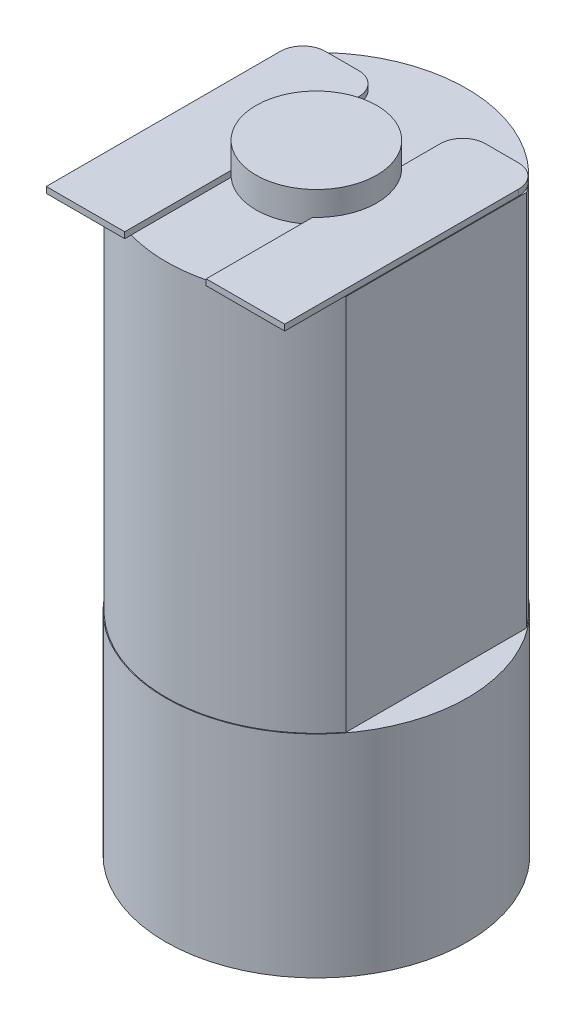
ISO-10303-21;
HEADER;
FILE_DESCRIPTION(('STEP AP214'),'2;1');
FILE_NAME('part.step','',(''),(''),'','','');
FILE_SCHEMA(('AUTOMOTIVE_DESIGN { 1 0 10303 214 1 1 1 1 }'));
ENDSEC;
DATA;
#1=APPLICATION_CONTEXT('core data for automotive mechanical design processes');
#2=APPLICATION_PROTOCOL_DEFINITION('international standard','automotive_design',2000,#1);
#3=PRODUCT_CONTEXT('',#1,'mechanical');
#4=PRODUCT('Part','Part','',(#3));
#5=PRODUCT_RELATED_PRODUCT_CATEGORY('part','',(#4));
#6=PRODUCT_DEFINITION_FORMATION('','',#4);
#7=PRODUCT_DEFINITION_CONTEXT('part definition',#1,'design');
#8=PRODUCT_DEFINITION('design','',#6,#7);
#9=PRODUCT_DEFINITION_SHAPE('','',#8);
#10=(LENGTH_UNIT() NAMED_UNIT(*) SI_UNIT(.MILLI.,.METRE.));
#11=(NAMED_UNIT(*) PLANE_ANGLE_UNIT() SI_UNIT($,.RADIAN.));
#12=(NAMED_UNIT(*) SI_UNIT($,.STERADIAN.) SOLID_ANGLE_UNIT());
#13=UNCERTAINTY_MEASURE_WITH_UNIT(LENGTH_MEASURE(1.E-05),#10,'distance_accuracy_value','');
#14=(GEOMETRIC_REPRESENTATION_CONTEXT(3) GLOBAL_UNCERTAINTY_ASSIGNED_CONTEXT((#13)) GLOBAL_UNIT_ASSIGNED_CONTEXT((#10,
#11,#12)) REPRESENTATION_CONTEXT('',''));
#15=CARTESIAN_POINT('',(0.,0.,0.));
#16=DIRECTION('',(0.,0.,1.));
#17=DIRECTION('',(1.,0.,0.));
#18=AXIS2_PLACEMENT_3D('',#15,#16,#17);
#19=CARTESIAN_POINT('',(0.,19.5,0.));
#20=DIRECTION('',(0.,1.,0.));
#21=DIRECTION('',(0.,0.,1.));
#22=AXIS2_PLACEMENT_3D('',#19,#20,#21);
#23=PLANE('',#22);
#24=DIRECTION('',(0.,0.,-1.));
#25=VECTOR('',#24,1.);
#26=CARTESIAN_POINT('',(-1.35,19.5,-2.75));
#27=LINE('',#26,#25);
#28=CARTESIAN_POINT('',(-1.35,19.5,-1.47563545633737));
#29=VERTEX_POINT('',#28);
#30=CARTESIAN_POINT('',(-1.35,19.5,-2.75));
#31=VERTEX_POINT('',#30);
#32=EDGE_CURVE('E314',#29,#31,#27,.T.);
#33=ORIENTED_EDGE('',*,*,#32,.F.);
#34=CARTESIAN_POINT('',(0.,19.5,0.));
#35=DIRECTION('',(0.,1.,0.));
#36=DIRECTION('',(0.,0.,1.));
#37=AXIS2_PLACEMENT_3D('',#34,#35,#36);
#38=CIRCLE('',#37,2.);
#39=CARTESIAN_POINT('',(1.35,19.5,-1.47563545633737));
#40=VERTEX_POINT('',#39);
#41=EDGE_CURVE('E466',#40,#29,#38,.T.);
#42=ORIENTED_EDGE('',*,*,#41,.F.);
#43=DIRECTION('',(0.,0.,1.));
#44=VECTOR('',#43,1.);
#45=CARTESIAN_POINT('',(1.35,19.5,-2.74999999999999));
#46=LINE('',#45,#44);
#47=CARTESIAN_POINT('',(1.35,19.5,-2.74999999999999));
#48=VERTEX_POINT('',#47);
#49=EDGE_CURVE('E207',#48,#40,#46,.T.);
#50=ORIENTED_EDGE('',*,*,#49,.F.);
#51=CARTESIAN_POINT('',(2.1,19.5,-2.74999999999999));
#52=DIRECTION('',(0.,1.,0.));
#53=DIRECTION('',(0.,0.,-1.));
#54=AXIS2_PLACEMENT_3D('',#51,#52,#53);
#55=CIRCLE('',#54,0.75);
#56=CARTESIAN_POINT('',(2.1,19.5,-3.49999999999999));
#57=VERTEX_POINT('',#56);
#58=EDGE_CURVE('E256',#57,#48,#55,.T.);
#59=ORIENTED_EDGE('',*,*,#58,.F.);
#60=DIRECTION('',(-1.,0.,0.));
#61=VECTOR('',#60,1.);
#62=CARTESIAN_POINT('',(3.2,19.5,-3.49999999999999));
#63=LINE('',#62,#61);
#64=CARTESIAN_POINT('',(3.2,19.5,-3.49999999999999));
#65=VERTEX_POINT('',#64);
#66=EDGE_CURVE('E253',#65,#57,#63,.T.);
#67=ORIENTED_EDGE('',*,*,#66,.F.);
#68=CARTESIAN_POINT('',(3.2,19.5,-2.74999999999999));
#69=DIRECTION('',(0.,1.,0.));
#70=DIRECTION('',(0.,0.,-1.));
#71=AXIS2_PLACEMENT_3D('',#68,#69,#70);
#72=CIRCLE('',#71,0.75);
#73=CARTESIAN_POINT('',(3.95,19.5,-2.74999999999999));
#74=VERTEX_POINT('',#73);
#75=EDGE_CURVE('E250',#74,#65,#72,.T.);
#76=ORIENTED_EDGE('',*,*,#75,.F.);
#77=DIRECTION('',(0.,0.,1.));
#78=VECTOR('',#77,1.);
#79=CARTESIAN_POINT('',(3.95,19.5,0.));
#80=LINE('',#79,#78);
#81=CARTESIAN_POINT('',(3.95,19.5,3.02458674863195));
#82=VERTEX_POINT('',#81);
#83=EDGE_CURVE('E48',#74,#82,#80,.T.);
#84=ORIENTED_EDGE('',*,*,#83,.T.);
#85=CARTESIAN_POINT('',(0.,19.5,0.));
#86=DIRECTION('',(0.,1.,0.));
#87=DIRECTION('',(0.,0.,1.));
#88=AXIS2_PLACEMENT_3D('',#85,#86,#87);
#89=CIRCLE('',#88,4.975);
#90=CARTESIAN_POINT('',(3.975,19.5,2.99165506033032));
#91=VERTEX_POINT('',#90);
#92=EDGE_CURVE('E367',#82,#91,#89,.T.);
#93=ORIENTED_EDGE('',*,*,#92,.T.);
#94=DIRECTION('',(0.,0.,-1.));
#95=VECTOR('',#94,1.);
#96=CARTESIAN_POINT('',(3.975,19.5,-2.99165506033032));
#97=LINE('',#96,#95);
#98=CARTESIAN_POINT('',(3.975,19.5,-2.99165506033032));
#99=VERTEX_POINT('',#98);
#100=EDGE_CURVE('E372',#91,#99,#97,.T.);
#101=ORIENTED_EDGE('',*,*,#100,.T.);
#102=CARTESIAN_POINT('',(0.,19.5,0.));
#103=DIRECTION('',(0.,1.,0.));
#104=DIRECTION('',(0.,0.,1.));
#105=AXIS2_PLACEMENT_3D('',#102,#103,#104);
#106=CIRCLE('',#105,4.975);
#107=CARTESIAN_POINT('',(-3.975,19.5,-2.99165506033032));
#108=VERTEX_POINT('',#107);
#109=EDGE_CURVE('E359',#99,#108,#106,.T.);
#110=ORIENTED_EDGE('',*,*,#109,.T.);
#111=DIRECTION('',(0.,0.,1.));
#112=VECTOR('',#111,1.);
#113=CARTESIAN_POINT('',(-3.975,19.5,-2.99165506033032));
#114=LINE('',#113,#112);
#115=CARTESIAN_POINT('',(-3.975,19.5,2.99165506033032));
#116=VERTEX_POINT('',#115);
#117=EDGE_CURVE('E363',#108,#116,#114,.T.);
#118=ORIENTED_EDGE('',*,*,#117,.T.);
#119=CARTESIAN_POINT('',(-3.95,19.5,3.02458674863195));
#120=VERTEX_POINT('',#119);
#121=EDGE_CURVE('E368',#116,#120,#89,.T.);
#122=ORIENTED_EDGE('',*,*,#121,.T.);
#123=DIRECTION('',(0.,0.,1.));
#124=VECTOR('',#123,1.);
#125=CARTESIAN_POINT('',(-3.95,19.5,-2.75));
#126=LINE('',#125,#124);
#127=CARTESIAN_POINT('',(-3.95,19.5,-2.75));
#128=VERTEX_POINT('',#127);
#129=EDGE_CURVE('E328',#128,#120,#126,.T.);
#130=ORIENTED_EDGE('',*,*,#129,.F.);
#131=CARTESIAN_POINT('',(-3.2,19.5,-2.75));
#132=DIRECTION('',(0.,1.,0.));
#133=DIRECTION('',(0.,0.,1.));
#134=AXIS2_PLACEMENT_3D('',#131,#132,#133);
#135=CIRCLE('',#134,0.75);
#136=CARTESIAN_POINT('',(-3.2,19.5,-3.5));
#137=VERTEX_POINT('',#136);
#138=EDGE_CURVE('E323',#137,#128,#135,.T.);
#139=ORIENTED_EDGE('',*,*,#138,.F.);
#140=DIRECTION('',(-1.,0.,0.));
#141=VECTOR('',#140,1.);
#142=CARTESIAN_POINT('',(-3.2,19.5,-3.5));
#143=LINE('',#142,#141);
#144=CARTESIAN_POINT('',(-2.10000000000001,19.5,-3.5));
#145=VERTEX_POINT('',#144);
#146=EDGE_CURVE('E319',#145,#137,#143,.T.);
#147=ORIENTED_EDGE('',*,*,#146,.F.);
#148=CARTESIAN_POINT('',(-2.1,19.5,-2.75));
#149=DIRECTION('',(0.,1.,0.));
#150=DIRECTION('',(0.,0.,1.));
#151=AXIS2_PLACEMENT_3D('',#148,#149,#150);
#152=CIRCLE('',#151,0.75);
#153=EDGE_CURVE('E313',#31,#145,#152,.T.);
#154=ORIENTED_EDGE('',*,*,#153,.F.);
#155=EDGE_LOOP('',(#33,#42,#50,#59,#67,#76,#84,#93,#101,#110,#118,#122,#130,#139,#147,#154));
#156=FACE_BOUND('',#155,.T.);
#157=ADVANCED_FACE('F39',(#156),#23,.T.);
#158=CARTESIAN_POINT('',(-1.35,19.7,-2.75));
#159=DIRECTION('',(-1.,0.,0.));
#160=DIRECTION('',(0.,0.,1.));
#161=AXIS2_PLACEMENT_3D('',#158,#159,#160);
#162=PLANE('',#161);
#163=DIRECTION('',(0.,-1.,0.));
#164=VECTOR('',#163,1.);
#165=CARTESIAN_POINT('',(-1.35,20.5,-1.47563545633737));
#166=LINE('',#165,#164);
#167=CARTESIAN_POINT('',(-1.35,19.7,-1.47563545633737));
#168=VERTEX_POINT('',#167);
#169=EDGE_CURVE('E55',#29,#168,#166,.F.);
#170=ORIENTED_EDGE('',*,*,#169,.F.);
#171=ORIENTED_EDGE('',*,*,#32,.T.);
#172=DIRECTION('',(0.,-1.,0.));
#173=VECTOR('',#172,1.);
#174=CARTESIAN_POINT('',(-1.35,19.7,-2.75));
#175=LINE('',#174,#173);
#176=CARTESIAN_POINT('',(-1.35,19.7,-2.75));
#177=VERTEX_POINT('',#176);
#178=EDGE_CURVE('E354',#177,#31,#175,.T.);
#179=ORIENTED_EDGE('',*,*,#178,.F.);
#180=DIRECTION('',(0.,0.,-1.));
#181=VECTOR('',#180,1.);
#182=CARTESIAN_POINT('',(-1.35,19.7,-2.75));
#183=LINE('',#182,#181);
#184=EDGE_CURVE('E294',#168,#177,#183,.T.);
#185=ORIENTED_EDGE('',*,*,#184,.F.);
#186=EDGE_LOOP('',(#170,#171,#179,#185));
#187=FACE_BOUND('',#186,.T.);
#188=ADVANCED_FACE('F423',(#187),#162,.F.);
#189=DIRECTION('',(0.,-1.,0.));
#190=VECTOR('',#189,1.);
#191=CARTESIAN_POINT('',(-1.35,20.5,1.47563545633737));
#192=LINE('',#191,#190);
#193=CARTESIAN_POINT('',(-1.35,19.7,1.47563545633737));
#194=VERTEX_POINT('',#193);
#195=CARTESIAN_POINT('',(-1.35,19.5,1.47563545633737));
#196=VERTEX_POINT('',#195);
#197=EDGE_CURVE('E222',#194,#196,#192,.T.);
#198=ORIENTED_EDGE('',*,*,#197,.F.);
#199=CARTESIAN_POINT('',(-1.35,19.7,5.));
#200=VERTEX_POINT('',#199);
#201=EDGE_CURVE('E289',#200,#194,#183,.T.);
#202=ORIENTED_EDGE('',*,*,#201,.F.);
#203=DIRECTION('',(0.,-1.,0.));
#204=VECTOR('',#203,1.);
#205=CARTESIAN_POINT('',(-1.35,19.7,5.));
#206=LINE('',#205,#204);
#207=CARTESIAN_POINT('',(-1.35,19.5,5.));
#208=VERTEX_POINT('',#207);
#209=EDGE_CURVE('E309',#200,#208,#206,.T.);
#210=ORIENTED_EDGE('',*,*,#209,.T.);
#211=CARTESIAN_POINT('',(-1.35,19.5,4.78833217310579));
#212=VERTEX_POINT('',#211);
#213=EDGE_CURVE('E288',#208,#212,#27,.T.);
#214=ORIENTED_EDGE('',*,*,#213,.T.);
#215=EDGE_CURVE('E315',#212,#196,#27,.T.);
#216=ORIENTED_EDGE('',*,*,#215,.T.);
#217=EDGE_LOOP('',(#198,#202,#210,#214,#216));
#218=FACE_BOUND('',#217,.T.);
#219=ADVANCED_FACE('F493',(#218),#162,.F.);
#220=CARTESIAN_POINT('',(1.35,19.7,-2.74999999999999));
#221=DIRECTION('',(1.,0.,0.));
#222=DIRECTION('',(0.,0.,-1.));
#223=AXIS2_PLACEMENT_3D('',#220,#221,#222);
#224=PLANE('',#223);
#225=DIRECTION('',(0.,-1.,0.));
#226=VECTOR('',#225,1.);
#227=CARTESIAN_POINT('',(1.35,20.5,1.47563545633737));
#228=LINE('',#227,#226);
#229=CARTESIAN_POINT('',(1.35,19.5,1.47563545633737));
#230=VERTEX_POINT('',#229);
#231=CARTESIAN_POINT('',(1.35,19.7,1.47563545633737));
#232=VERTEX_POINT('',#231);
#233=EDGE_CURVE('E211',#230,#232,#228,.F.);
#234=ORIENTED_EDGE('',*,*,#233,.F.);
#235=CARTESIAN_POINT('',(1.35,19.5,4.78833217310579));
#236=VERTEX_POINT('',#235);
#237=EDGE_CURVE('E263',#230,#236,#46,.T.);
#238=ORIENTED_EDGE('',*,*,#237,.T.);
#239=CARTESIAN_POINT('',(1.35,19.5,5.));
#240=VERTEX_POINT('',#239);
#241=EDGE_CURVE('E260',#236,#240,#46,.T.);
#242=ORIENTED_EDGE('',*,*,#241,.T.);
#243=DIRECTION('',(0.,-1.,0.));
#244=VECTOR('',#243,1.);
#245=CARTESIAN_POINT('',(1.35,19.7,5.));
#246=LINE('',#245,#244);
#247=CARTESIAN_POINT('',(1.35,19.7,5.));
#248=VERTEX_POINT('',#247);
#249=EDGE_CURVE('E269',#248,#240,#246,.T.);
#250=ORIENTED_EDGE('',*,*,#249,.F.);
#251=DIRECTION('',(0.,0.,1.));
#252=VECTOR('',#251,1.);
#253=CARTESIAN_POINT('',(1.35,19.7,-2.74999999999999));
#254=LINE('',#253,#252);
#255=EDGE_CURVE('E200',#232,#248,#254,.T.);
#256=ORIENTED_EDGE('',*,*,#255,.F.);
#257=EDGE_LOOP('',(#234,#238,#242,#250,#256));
#258=FACE_BOUND('',#257,.T.);
#259=ADVANCED_FACE('F440',(#258),#224,.F.);
#260=DIRECTION('',(0.,-1.,0.));
#261=VECTOR('',#260,1.);
#262=CARTESIAN_POINT('',(1.35,20.5,-1.47563545633737));
#263=LINE('',#262,#261);
#264=CARTESIAN_POINT('',(1.35,19.7,-1.47563545633737));
#265=VERTEX_POINT('',#264);
#266=EDGE_CURVE('E204',#265,#40,#263,.T.);
#267=ORIENTED_EDGE('',*,*,#266,.F.);
#268=CARTESIAN_POINT('',(1.35,19.7,-2.74999999999999));
#269=VERTEX_POINT('',#268);
#270=EDGE_CURVE('E190',#269,#265,#254,.T.);
#271=ORIENTED_EDGE('',*,*,#270,.F.);
#272=DIRECTION('',(0.,-1.,0.));
#273=VECTOR('',#272,1.);
#274=CARTESIAN_POINT('',(1.35,19.7,-2.74999999999999));
#275=LINE('',#274,#273);
#276=EDGE_CURVE('E273',#269,#48,#275,.T.);
#277=ORIENTED_EDGE('',*,*,#276,.T.);
#278=ORIENTED_EDGE('',*,*,#49,.T.);
#279=EDGE_LOOP('',(#267,#271,#277,#278));
#280=FACE_BOUND('',#279,.T.);
#281=ADVANCED_FACE('F205',(#280),#224,.F.);
#282=ORIENTED_EDGE('',*,*,#237,.F.);
#283=EDGE_CURVE('E63',#196,#230,#38,.T.);
#284=ORIENTED_EDGE('',*,*,#283,.F.);
#285=ORIENTED_EDGE('',*,*,#215,.F.);
#286=EDGE_CURVE('E508',#212,#236,#89,.T.);
#287=ORIENTED_EDGE('',*,*,#286,.T.);
#288=EDGE_LOOP('',(#282,#284,#285,#287));
#289=FACE_BOUND('',#288,.T.);
#290=ADVANCED_FACE('F487',(#289),#23,.T.);
#291=CARTESIAN_POINT('',(0.,7.,0.));
#292=DIRECTION('',(0.,-1.,0.));
#293=DIRECTION('',(0.,0.,-1.));
#294=AXIS2_PLACEMENT_3D('',#291,#292,#293);
#295=CYLINDRICAL_SURFACE('',#294,5.);
#296=CARTESIAN_POINT('',(0.,7.,0.));
#297=DIRECTION('',(0.,1.,0.));
#298=DIRECTION('',(0.,0.,1.));
#299=AXIS2_PLACEMENT_3D('',#296,#297,#298);
#300=CIRCLE('',#299,5.);
#301=CARTESIAN_POINT('',(0.,7.,5.));
#302=VERTEX_POINT('',#301);
#303=EDGE_CURVE('E407',#302,#302,#300,.T.);
#304=ORIENTED_EDGE('',*,*,#303,.F.);
#305=EDGE_LOOP('',(#304));
#306=FACE_BOUND('',#305,.T.);
#307=CARTESIAN_POINT('',(0.,0.,0.));
#308=DIRECTION('',(0.,1.,0.));
#309=DIRECTION('',(0.,0.,1.));
#310=AXIS2_PLACEMENT_3D('',#307,#308,#309);
#311=CIRCLE('',#310,5.);
#312=CARTESIAN_POINT('',(0.,0.,5.));
#313=VERTEX_POINT('',#312);
#314=EDGE_CURVE('E406',#313,#313,#311,.T.);
#315=ORIENTED_EDGE('',*,*,#314,.T.);
#316=EDGE_LOOP('',(#315));
#317=FACE_BOUND('',#316,.T.);
#318=ADVANCED_FACE('F41',(#306,#317),#295,.T.);
#319=CARTESIAN_POINT('',(0.,7.,0.));
#320=DIRECTION('',(0.,1.,0.));
#321=DIRECTION('',(0.,0.,1.));
#322=AXIS2_PLACEMENT_3D('',#319,#320,#321);
#323=PLANE('',#322);
#324=CARTESIAN_POINT('',(0.,7.,0.));
#325=DIRECTION('',(0.,1.,0.));
#326=DIRECTION('',(0.,0.,1.));
#327=AXIS2_PLACEMENT_3D('',#324,#325,#326);
#328=CIRCLE('',#327,4.975);
#329=CARTESIAN_POINT('',(3.975,7.,-2.99165506033032));
#330=VERTEX_POINT('',#329);
#331=CARTESIAN_POINT('',(-3.975,7.,-2.99165506033032));
#332=VERTEX_POINT('',#331);
#333=EDGE_CURVE('E358',#330,#332,#328,.T.);
#334=ORIENTED_EDGE('',*,*,#333,.F.);
#335=DIRECTION('',(0.,0.,-1.));
#336=VECTOR('',#335,1.);
#337=CARTESIAN_POINT('',(3.975,7.,-2.99165506033032));
#338=LINE('',#337,#336);
#339=CARTESIAN_POINT('',(3.975,7.,2.99165506033032));
#340=VERTEX_POINT('',#339);
#341=EDGE_CURVE('E364',#340,#330,#338,.T.);
#342=ORIENTED_EDGE('',*,*,#341,.F.);
#343=CARTESIAN_POINT('',(0.,7.,0.));
#344=DIRECTION('',(0.,1.,0.));
#345=DIRECTION('',(0.,0.,1.));
#346=AXIS2_PLACEMENT_3D('',#343,#344,#345);
#347=CIRCLE('',#346,4.975);
#348=CARTESIAN_POINT('',(-3.975,7.,2.99165506033032));
#349=VERTEX_POINT('',#348);
#350=EDGE_CURVE('E384',#349,#340,#347,.T.);
#351=ORIENTED_EDGE('',*,*,#350,.F.);
#352=DIRECTION('',(0.,0.,1.));
#353=VECTOR('',#352,1.);
#354=CARTESIAN_POINT('',(-3.975,7.,-2.99165506033032));
#355=LINE('',#354,#353);
#356=EDGE_CURVE('E380',#332,#349,#355,.T.);
#357=ORIENTED_EDGE('',*,*,#356,.F.);
#358=EDGE_LOOP('',(#334,#342,#351,#357));
#359=FACE_BOUND('',#358,.T.);
#360=ORIENTED_EDGE('',*,*,#303,.T.);
#361=EDGE_LOOP('',(#360));
#362=FACE_BOUND('',#361,.T.);
#363=ADVANCED_FACE('F502',(#359,#362),#323,.T.);
#364=CARTESIAN_POINT('',(0.,0.,0.));
#365=DIRECTION('',(0.,1.,0.));
#366=DIRECTION('',(0.,0.,1.));
#367=AXIS2_PLACEMENT_3D('',#364,#365,#366);
#368=PLANE('',#367);
#369=ORIENTED_EDGE('',*,*,#314,.F.);
#370=EDGE_LOOP('',(#369));
#371=FACE_BOUND('',#370,.T.);
#372=ADVANCED_FACE('F679',(#371),#368,.F.);
#373=CARTESIAN_POINT('',(0.,19.5,0.));
#374=DIRECTION('',(0.,-1.,0.));
#375=DIRECTION('',(0.,0.,-1.));
#376=AXIS2_PLACEMENT_3D('',#373,#374,#375);
#377=CYLINDRICAL_SURFACE('',#376,4.975);
#378=ORIENTED_EDGE('',*,*,#333,.T.);
#379=DIRECTION('',(0.,-1.,0.));
#380=VECTOR('',#379,1.);
#381=CARTESIAN_POINT('',(-3.975,19.5,-2.99165506033032));
#382=LINE('',#381,#380);
#383=EDGE_CURVE('E402',#108,#332,#382,.T.);
#384=ORIENTED_EDGE('',*,*,#383,.F.);
#385=ORIENTED_EDGE('',*,*,#109,.F.);
#386=DIRECTION('',(0.,-1.,0.));
#387=VECTOR('',#386,1.);
#388=CARTESIAN_POINT('',(3.975,19.5,-2.99165506033032));
#389=LINE('',#388,#387);
#390=EDGE_CURVE('E376',#99,#330,#389,.T.);
#391=ORIENTED_EDGE('',*,*,#390,.T.);
#392=EDGE_LOOP('',(#378,#384,#385,#391));
#393=FACE_BOUND('',#392,.T.);
#394=ADVANCED_FACE('F524',(#393),#377,.T.);
#395=CARTESIAN_POINT('',(-3.975,19.5,-2.99165506033032));
#396=DIRECTION('',(1.,0.,0.));
#397=DIRECTION('',(0.,0.,-1.));
#398=AXIS2_PLACEMENT_3D('',#395,#396,#397);
#399=PLANE('',#398);
#400=ORIENTED_EDGE('',*,*,#356,.T.);
#401=DIRECTION('',(0.,-1.,0.));
#402=VECTOR('',#401,1.);
#403=CARTESIAN_POINT('',(-3.975,19.5,2.99165506033032));
#404=LINE('',#403,#402);
#405=EDGE_CURVE('E398',#116,#349,#404,.T.);
#406=ORIENTED_EDGE('',*,*,#405,.F.);
#407=ORIENTED_EDGE('',*,*,#117,.F.);
#408=ORIENTED_EDGE('',*,*,#383,.T.);
#409=EDGE_LOOP('',(#400,#406,#407,#408));
#410=FACE_BOUND('',#409,.T.);
#411=ADVANCED_FACE('F529',(#410),#399,.F.);
#412=CARTESIAN_POINT('',(0.,19.5,0.));
#413=DIRECTION('',(0.,-1.,0.));
#414=DIRECTION('',(0.,0.,-1.));
#415=AXIS2_PLACEMENT_3D('',#412,#413,#414);
#416=CYLINDRICAL_SURFACE('',#415,4.975);
#417=ORIENTED_EDGE('',*,*,#350,.T.);
#418=DIRECTION('',(0.,-1.,0.));
#419=VECTOR('',#418,1.);
#420=CARTESIAN_POINT('',(3.975,19.5,2.99165506033032));
#421=LINE('',#420,#419);
#422=EDGE_CURVE('E394',#91,#340,#421,.T.);
#423=ORIENTED_EDGE('',*,*,#422,.F.);
#424=ORIENTED_EDGE('',*,*,#92,.F.);
#425=EDGE_CURVE('E450',#236,#82,#89,.T.);
#426=ORIENTED_EDGE('',*,*,#425,.F.);
#427=ORIENTED_EDGE('',*,*,#286,.F.);
#428=EDGE_CURVE('E373',#120,#212,#89,.T.);
#429=ORIENTED_EDGE('',*,*,#428,.F.);
#430=ORIENTED_EDGE('',*,*,#121,.F.);
#431=ORIENTED_EDGE('',*,*,#405,.T.);
#432=EDGE_LOOP('',(#417,#423,#424,#426,#427,#429,#430,#431));
#433=FACE_BOUND('',#432,.T.);
#434=ADVANCED_FACE('F518',(#433),#416,.T.);
#435=CARTESIAN_POINT('',(3.975,19.5,-2.99165506033032));
#436=DIRECTION('',(-1.,0.,0.));
#437=DIRECTION('',(0.,0.,1.));
#438=AXIS2_PLACEMENT_3D('',#435,#436,#437);
#439=PLANE('',#438);
#440=ORIENTED_EDGE('',*,*,#341,.T.);
#441=ORIENTED_EDGE('',*,*,#390,.F.);
#442=ORIENTED_EDGE('',*,*,#100,.F.);
#443=ORIENTED_EDGE('',*,*,#422,.T.);
#444=EDGE_LOOP('',(#440,#441,#442,#443));
#445=FACE_BOUND('',#444,.T.);
#446=ADVANCED_FACE('F520',(#445),#439,.F.);
#447=CARTESIAN_POINT('',(-3.2,19.5,-2.75));
#448=DIRECTION('',(0.,1.,0.));
#449=DIRECTION('',(0.,0.,1.));
#450=AXIS2_PLACEMENT_3D('',#447,#448,#449);
#451=PLANE('',#450);
#452=CARTESIAN_POINT('',(-3.95,19.5,5.));
#453=VERTEX_POINT('',#452);
#454=EDGE_CURVE('E327',#120,#453,#126,.T.);
#455=ORIENTED_EDGE('',*,*,#454,.F.);
#456=ORIENTED_EDGE('',*,*,#428,.T.);
#457=ORIENTED_EDGE('',*,*,#213,.F.);
#458=DIRECTION('',(1.,0.,0.));
#459=VECTOR('',#458,1.);
#460=CARTESIAN_POINT('',(-3.95,19.5,5.));
#461=LINE('',#460,#459);
#462=EDGE_CURVE('E332',#453,#208,#461,.T.);
#463=ORIENTED_EDGE('',*,*,#462,.F.);
#464=EDGE_LOOP('',(#455,#456,#457,#463));
#465=FACE_BOUND('',#464,.T.);
#466=ADVANCED_FACE('F532',(#465),#451,.F.);
#467=CARTESIAN_POINT('',(-2.1,19.7,-2.75));
#468=DIRECTION('',(0.,-1.,0.));
#469=DIRECTION('',(0.,0.,-1.));
#470=AXIS2_PLACEMENT_3D('',#467,#468,#469);
#471=CYLINDRICAL_SURFACE('',#470,0.75);
#472=ORIENTED_EDGE('',*,*,#153,.T.);
#473=DIRECTION('',(0.,-1.,0.));
#474=VECTOR('',#473,1.);
#475=CARTESIAN_POINT('',(-2.10000000000001,19.7,-3.5));
#476=LINE('',#475,#474);
#477=CARTESIAN_POINT('',(-2.10000000000001,19.7,-3.5));
#478=VERTEX_POINT('',#477);
#479=EDGE_CURVE('E350',#478,#145,#476,.T.);
#480=ORIENTED_EDGE('',*,*,#479,.F.);
#481=CARTESIAN_POINT('',(-2.1,19.7,-2.75));
#482=DIRECTION('',(0.,1.,0.));
#483=DIRECTION('',(0.,0.,1.));
#484=AXIS2_PLACEMENT_3D('',#481,#482,#483);
#485=CIRCLE('',#484,0.75);
#486=EDGE_CURVE('E293',#177,#478,#485,.T.);
#487=ORIENTED_EDGE('',*,*,#486,.F.);
#488=ORIENTED_EDGE('',*,*,#178,.T.);
#489=EDGE_LOOP('',(#472,#480,#487,#488));
#490=FACE_BOUND('',#489,.T.);
#491=ADVANCED_FACE('F427',(#490),#471,.T.);
#492=CARTESIAN_POINT('',(-3.2,19.7,-3.5));
#493=DIRECTION('',(0.,0.,1.));
#494=DIRECTION('',(1.,0.,0.));
#495=AXIS2_PLACEMENT_3D('',#492,#493,#494);
#496=PLANE('',#495);
#497=ORIENTED_EDGE('',*,*,#146,.T.);
#498=DIRECTION('',(0.,-1.,0.));
#499=VECTOR('',#498,1.);
#500=CARTESIAN_POINT('',(-3.2,19.7,-3.5));
#501=LINE('',#500,#499);
#502=CARTESIAN_POINT('',(-3.2,19.7,-3.5));
#503=VERTEX_POINT('',#502);
#504=EDGE_CURVE('E346',#503,#137,#501,.T.);
#505=ORIENTED_EDGE('',*,*,#504,.F.);
#506=DIRECTION('',(-1.,0.,0.));
#507=VECTOR('',#506,1.);
#508=CARTESIAN_POINT('',(-3.2,19.7,-3.5));
#509=LINE('',#508,#507);
#510=EDGE_CURVE('E297',#478,#503,#509,.T.);
#511=ORIENTED_EDGE('',*,*,#510,.F.);
#512=ORIENTED_EDGE('',*,*,#479,.T.);
#513=EDGE_LOOP('',(#497,#505,#511,#512));
#514=FACE_BOUND('',#513,.T.);
#515=ADVANCED_FACE('F548',(#514),#496,.F.);
#516=CARTESIAN_POINT('',(-3.2,19.7,-2.75));
#517=DIRECTION('',(0.,-1.,0.));
#518=DIRECTION('',(0.,0.,-1.));
#519=AXIS2_PLACEMENT_3D('',#516,#517,#518);
#520=CYLINDRICAL_SURFACE('',#519,0.75);
#521=ORIENTED_EDGE('',*,*,#138,.T.);
#522=DIRECTION('',(0.,-1.,0.));
#523=VECTOR('',#522,1.);
#524=CARTESIAN_POINT('',(-3.95,19.7,-2.75));
#525=LINE('',#524,#523);
#526=CARTESIAN_POINT('',(-3.95,19.7,-2.75));
#527=VERTEX_POINT('',#526);
#528=EDGE_CURVE('E342',#527,#128,#525,.T.);
#529=ORIENTED_EDGE('',*,*,#528,.F.);
#530=CARTESIAN_POINT('',(-3.2,19.7,-2.75));
#531=DIRECTION('',(0.,1.,0.));
#532=DIRECTION('',(0.,0.,1.));
#533=AXIS2_PLACEMENT_3D('',#530,#531,#532);
#534=CIRCLE('',#533,0.75);
#535=EDGE_CURVE('E300',#503,#527,#534,.T.);
#536=ORIENTED_EDGE('',*,*,#535,.F.);
#537=ORIENTED_EDGE('',*,*,#504,.T.);
#538=EDGE_LOOP('',(#521,#529,#536,#537));
#539=FACE_BOUND('',#538,.T.);
#540=ADVANCED_FACE('F545',(#539),#520,.T.);
#541=CARTESIAN_POINT('',(-3.95,19.7,-2.75));
#542=DIRECTION('',(1.,0.,0.));
#543=DIRECTION('',(0.,0.,-1.));
#544=AXIS2_PLACEMENT_3D('',#541,#542,#543);
#545=PLANE('',#544);
#546=ORIENTED_EDGE('',*,*,#129,.T.);
#547=ORIENTED_EDGE('',*,*,#454,.T.);
#548=DIRECTION('',(0.,-1.,0.));
#549=VECTOR('',#548,1.);
#550=CARTESIAN_POINT('',(-3.95,19.7,5.));
#551=LINE('',#550,#549);
#552=CARTESIAN_POINT('',(-3.95,19.7,5.));
#553=VERTEX_POINT('',#552);
#554=EDGE_CURVE('E338',#553,#453,#551,.T.);
#555=ORIENTED_EDGE('',*,*,#554,.F.);
#556=DIRECTION('',(0.,0.,1.));
#557=VECTOR('',#556,1.);
#558=CARTESIAN_POINT('',(-3.95,19.7,-2.75));
#559=LINE('',#558,#557);
#560=EDGE_CURVE('E303',#527,#553,#559,.T.);
#561=ORIENTED_EDGE('',*,*,#560,.F.);
#562=ORIENTED_EDGE('',*,*,#528,.T.);
#563=EDGE_LOOP('',(#546,#547,#555,#561,#562));
#564=FACE_BOUND('',#563,.T.);
#565=ADVANCED_FACE('F542',(#564),#545,.F.);
#566=CARTESIAN_POINT('',(-3.95,19.7,5.));
#567=DIRECTION('',(0.,0.,-1.));
#568=DIRECTION('',(-1.,0.,0.));
#569=AXIS2_PLACEMENT_3D('',#566,#567,#568);
#570=PLANE('',#569);
#571=ORIENTED_EDGE('',*,*,#462,.T.);
#572=ORIENTED_EDGE('',*,*,#209,.F.);
#573=DIRECTION('',(1.,0.,0.));
#574=VECTOR('',#573,1.);
#575=CARTESIAN_POINT('',(-3.95,19.7,5.));
#576=LINE('',#575,#574);
#577=EDGE_CURVE('E306',#553,#200,#576,.T.);
#578=ORIENTED_EDGE('',*,*,#577,.F.);
#579=ORIENTED_EDGE('',*,*,#554,.T.);
#580=EDGE_LOOP('',(#571,#572,#578,#579));
#581=FACE_BOUND('',#580,.T.);
#582=ADVANCED_FACE('F538',(#581),#570,.F.);
#583=CARTESIAN_POINT('',(-3.2,19.7,-2.75));
#584=DIRECTION('',(0.,1.,0.));
#585=DIRECTION('',(0.,0.,1.));
#586=AXIS2_PLACEMENT_3D('',#583,#584,#585);
#587=PLANE('',#586);
#588=ORIENTED_EDGE('',*,*,#201,.T.);
#589=CARTESIAN_POINT('',(0.,19.7,0.));
#590=DIRECTION('',(0.,1.,0.));
#591=DIRECTION('',(0.,0.,1.));
#592=AXIS2_PLACEMENT_3D('',#589,#590,#591);
#593=CIRCLE('',#592,2.);
#594=EDGE_CURVE('E219',#194,#168,#593,.F.);
#595=ORIENTED_EDGE('',*,*,#594,.T.);
#596=ORIENTED_EDGE('',*,*,#184,.T.);
#597=ORIENTED_EDGE('',*,*,#486,.T.);
#598=ORIENTED_EDGE('',*,*,#510,.T.);
#599=ORIENTED_EDGE('',*,*,#535,.T.);
#600=ORIENTED_EDGE('',*,*,#560,.T.);
#601=ORIENTED_EDGE('',*,*,#577,.T.);
#602=EDGE_LOOP('',(#588,#595,#596,#597,#598,#599,#600,#601));
#603=FACE_BOUND('',#602,.T.);
#604=ADVANCED_FACE('F430',(#603),#587,.T.);
#605=CARTESIAN_POINT('',(3.95,19.7,-2.74999999999999));
#606=DIRECTION('',(-1.,0.,0.));
#607=DIRECTION('',(0.,0.,1.));
#608=AXIS2_PLACEMENT_3D('',#605,#606,#607);
#609=PLANE('',#608);
#610=DIRECTION('',(0.,0.,-1.));
#611=VECTOR('',#610,1.);
#612=CARTESIAN_POINT('',(3.95,19.5,-2.74999999999999));
#613=LINE('',#612,#611);
#614=CARTESIAN_POINT('',(3.95,19.5,5.));
#615=VERTEX_POINT('',#614);
#616=EDGE_CURVE('E230',#615,#82,#613,.T.);
#617=ORIENTED_EDGE('',*,*,#616,.T.);
#618=ORIENTED_EDGE('',*,*,#83,.F.);
#619=DIRECTION('',(0.,-1.,0.));
#620=VECTOR('',#619,1.);
#621=CARTESIAN_POINT('',(3.95,19.7,-2.74999999999999));
#622=LINE('',#621,#620);
#623=CARTESIAN_POINT('',(3.95,19.7,-2.74999999999999));
#624=VERTEX_POINT('',#623);
#625=EDGE_CURVE('E284',#624,#74,#622,.T.);
#626=ORIENTED_EDGE('',*,*,#625,.F.);
#627=DIRECTION('',(0.,0.,-1.));
#628=VECTOR('',#627,1.);
#629=CARTESIAN_POINT('',(3.95,19.7,-2.74999999999999));
#630=LINE('',#629,#628);
#631=CARTESIAN_POINT('',(3.95,19.7,5.));
#632=VERTEX_POINT('',#631);
#633=EDGE_CURVE('E231',#632,#624,#630,.T.);
#634=ORIENTED_EDGE('',*,*,#633,.F.);
#635=DIRECTION('',(0.,-1.,0.));
#636=VECTOR('',#635,1.);
#637=CARTESIAN_POINT('',(3.95,19.7,5.));
#638=LINE('',#637,#636);
#639=EDGE_CURVE('E246',#632,#615,#638,.T.);
#640=ORIENTED_EDGE('',*,*,#639,.T.);
#641=EDGE_LOOP('',(#617,#618,#626,#634,#640));
#642=FACE_BOUND('',#641,.T.);
#643=ADVANCED_FACE('F452',(#642),#609,.F.);
#644=CARTESIAN_POINT('',(3.2,19.7,-2.74999999999999));
#645=DIRECTION('',(0.,-1.,0.));
#646=DIRECTION('',(0.,0.,-1.));
#647=AXIS2_PLACEMENT_3D('',#644,#645,#646);
#648=CYLINDRICAL_SURFACE('',#647,0.75);
#649=ORIENTED_EDGE('',*,*,#75,.T.);
#650=DIRECTION('',(0.,-1.,0.));
#651=VECTOR('',#650,1.);
#652=CARTESIAN_POINT('',(3.2,19.7,-3.49999999999999));
#653=LINE('',#652,#651);
#654=CARTESIAN_POINT('',(3.2,19.7,-3.49999999999999));
#655=VERTEX_POINT('',#654);
#656=EDGE_CURVE('E280',#655,#65,#653,.T.);
#657=ORIENTED_EDGE('',*,*,#656,.F.);
#658=CARTESIAN_POINT('',(3.2,19.7,-2.74999999999999));
#659=DIRECTION('',(0.,1.,0.));
#660=DIRECTION('',(0.,0.,-1.));
#661=AXIS2_PLACEMENT_3D('',#658,#659,#660);
#662=CIRCLE('',#661,0.75);
#663=EDGE_CURVE('E235',#624,#655,#662,.T.);
#664=ORIENTED_EDGE('',*,*,#663,.F.);
#665=ORIENTED_EDGE('',*,*,#625,.T.);
#666=EDGE_LOOP('',(#649,#657,#664,#665));
#667=FACE_BOUND('',#666,.T.);
#668=ADVANCED_FACE('F459',(#667),#648,.T.);
#669=CARTESIAN_POINT('',(3.2,19.7,-3.49999999999999));
#670=DIRECTION('',(0.,0.,1.));
#671=DIRECTION('',(1.,0.,0.));
#672=AXIS2_PLACEMENT_3D('',#669,#670,#671);
#673=PLANE('',#672);
#674=ORIENTED_EDGE('',*,*,#66,.T.);
#675=DIRECTION('',(0.,-1.,0.));
#676=VECTOR('',#675,1.);
#677=CARTESIAN_POINT('',(2.1,19.7,-3.49999999999999));
#678=LINE('',#677,#676);
#679=CARTESIAN_POINT('',(2.1,19.7,-3.49999999999999));
#680=VERTEX_POINT('',#679);
#681=EDGE_CURVE('E276',#680,#57,#678,.T.);
#682=ORIENTED_EDGE('',*,*,#681,.F.);
#683=DIRECTION('',(-1.,0.,0.));
#684=VECTOR('',#683,1.);
#685=CARTESIAN_POINT('',(3.2,19.7,-3.49999999999999));
#686=LINE('',#685,#684);
#687=EDGE_CURVE('E239',#655,#680,#686,.T.);
#688=ORIENTED_EDGE('',*,*,#687,.F.);
#689=ORIENTED_EDGE('',*,*,#656,.T.);
#690=EDGE_LOOP('',(#674,#682,#688,#689));
#691=FACE_BOUND('',#690,.T.);
#692=ADVANCED_FACE('F462',(#691),#673,.F.);
#693=CARTESIAN_POINT('',(2.1,19.7,-2.74999999999999));
#694=DIRECTION('',(0.,-1.,0.));
#695=DIRECTION('',(0.,0.,-1.));
#696=AXIS2_PLACEMENT_3D('',#693,#694,#695);
#697=CYLINDRICAL_SURFACE('',#696,0.75);
#698=ORIENTED_EDGE('',*,*,#58,.T.);
#699=ORIENTED_EDGE('',*,*,#276,.F.);
#700=CARTESIAN_POINT('',(2.1,19.7,-2.74999999999999));
#701=DIRECTION('',(0.,1.,0.));
#702=DIRECTION('',(0.,0.,-1.));
#703=AXIS2_PLACEMENT_3D('',#700,#701,#702);
#704=CIRCLE('',#703,0.75);
#705=EDGE_CURVE('E195',#680,#269,#704,.T.);
#706=ORIENTED_EDGE('',*,*,#705,.F.);
#707=ORIENTED_EDGE('',*,*,#681,.T.);
#708=EDGE_LOOP('',(#698,#699,#706,#707));
#709=FACE_BOUND('',#708,.T.);
#710=ADVANCED_FACE('F465',(#709),#697,.T.);
#711=CARTESIAN_POINT('',(3.95,19.7,5.));
#712=DIRECTION('',(0.,0.,-1.));
#713=DIRECTION('',(-1.,0.,0.));
#714=AXIS2_PLACEMENT_3D('',#711,#712,#713);
#715=PLANE('',#714);
#716=DIRECTION('',(1.,0.,0.));
#717=VECTOR('',#716,1.);
#718=CARTESIAN_POINT('',(3.95,19.5,5.));
#719=LINE('',#718,#717);
#720=EDGE_CURVE('E236',#240,#615,#719,.T.);
#721=ORIENTED_EDGE('',*,*,#720,.T.);
#722=ORIENTED_EDGE('',*,*,#639,.F.);
#723=DIRECTION('',(1.,0.,0.));
#724=VECTOR('',#723,1.);
#725=CARTESIAN_POINT('',(3.95,19.7,5.));
#726=LINE('',#725,#724);
#727=EDGE_CURVE('E199',#248,#632,#726,.T.);
#728=ORIENTED_EDGE('',*,*,#727,.F.);
#729=ORIENTED_EDGE('',*,*,#249,.T.);
#730=EDGE_LOOP('',(#721,#722,#728,#729));
#731=FACE_BOUND('',#730,.T.);
#732=ADVANCED_FACE('F446',(#731),#715,.F.);
#733=CARTESIAN_POINT('',(2.1,19.7,-2.74999999999999));
#734=DIRECTION('',(0.,-1.,0.));
#735=DIRECTION('',(0.,0.,-1.));
#736=AXIS2_PLACEMENT_3D('',#733,#734,#735);
#737=PLANE('',#736);
#738=CARTESIAN_POINT('',(0.,19.7,0.));
#739=DIRECTION('',(0.,-1.,0.));
#740=DIRECTION('',(0.,0.,-1.));
#741=AXIS2_PLACEMENT_3D('',#738,#739,#740);
#742=CIRCLE('',#741,2.);
#743=EDGE_CURVE('E11',#232,#265,#742,.F.);
#744=ORIENTED_EDGE('',*,*,#743,.F.);
#745=ORIENTED_EDGE('',*,*,#255,.T.);
#746=ORIENTED_EDGE('',*,*,#727,.T.);
#747=ORIENTED_EDGE('',*,*,#633,.T.);
#748=ORIENTED_EDGE('',*,*,#663,.T.);
#749=ORIENTED_EDGE('',*,*,#687,.T.);
#750=ORIENTED_EDGE('',*,*,#705,.T.);
#751=ORIENTED_EDGE('',*,*,#270,.T.);
#752=EDGE_LOOP('',(#744,#745,#746,#747,#748,#749,#750,#751));
#753=FACE_BOUND('',#752,.T.);
#754=ADVANCED_FACE('F192',(#753),#737,.F.);
#755=CARTESIAN_POINT('',(2.1,19.5,-2.74999999999999));
#756=DIRECTION('',(0.,-1.,0.));
#757=DIRECTION('',(0.,0.,-1.));
#758=AXIS2_PLACEMENT_3D('',#755,#756,#757);
#759=PLANE('',#758);
#760=ORIENTED_EDGE('',*,*,#425,.T.);
#761=ORIENTED_EDGE('',*,*,#616,.F.);
#762=ORIENTED_EDGE('',*,*,#720,.F.);
#763=ORIENTED_EDGE('',*,*,#241,.F.);
#764=EDGE_LOOP('',(#760,#761,#762,#763));
#765=FACE_BOUND('',#764,.T.);
#766=ADVANCED_FACE('F449',(#765),#759,.T.);
#767=CARTESIAN_POINT('',(0.,20.5,0.));
#768=DIRECTION('',(0.,-1.,0.));
#769=DIRECTION('',(0.,0.,-1.));
#770=AXIS2_PLACEMENT_3D('',#767,#768,#769);
#771=CYLINDRICAL_SURFACE('',#770,2.);
#772=CARTESIAN_POINT('',(0.,20.5,0.));
#773=DIRECTION('',(0.,1.,0.));
#774=DIRECTION('',(0.,0.,1.));
#775=AXIS2_PLACEMENT_3D('',#772,#773,#774);
#776=CIRCLE('',#775,2.);
#777=CARTESIAN_POINT('',(0.,20.5,2.));
#778=VERTEX_POINT('',#777);
#779=EDGE_CURVE('E212',#778,#778,#776,.T.);
#780=ORIENTED_EDGE('',*,*,#779,.F.);
#781=EDGE_LOOP('',(#780));
#782=FACE_BOUND('',#781,.T.);
#783=ORIENTED_EDGE('',*,*,#41,.T.);
#784=ORIENTED_EDGE('',*,*,#169,.T.);
#785=ORIENTED_EDGE('',*,*,#594,.F.);
#786=ORIENTED_EDGE('',*,*,#197,.T.);
#787=ORIENTED_EDGE('',*,*,#283,.T.);
#788=ORIENTED_EDGE('',*,*,#233,.T.);
#789=ORIENTED_EDGE('',*,*,#743,.T.);
#790=ORIENTED_EDGE('',*,*,#266,.T.);
#791=EDGE_LOOP('',(#783,#784,#785,#786,#787,#788,#789,#790));
#792=FACE_BOUND('',#791,.T.);
#793=ADVANCED_FACE('F215',(#782,#792),#771,.T.);
#794=CARTESIAN_POINT('',(0.,20.5,0.));
#795=DIRECTION('',(0.,1.,0.));
#796=DIRECTION('',(0.,0.,1.));
#797=AXIS2_PLACEMENT_3D('',#794,#795,#796);
#798=PLANE('',#797);
#799=ORIENTED_EDGE('',*,*,#779,.T.);
#800=EDGE_LOOP('',(#799));
#801=FACE_BOUND('',#800,.T.);
#802=ADVANCED_FACE('F474',(#801),#798,.T.);
#803=CLOSED_SHELL('',(#157,#188,#219,#259,#281,#290,#318,#363,#372,#394,#411,#434,#446,#466,
#491,#515,#540,#565,#582,#604,#643,#668,#692,#710,#732,#754,#766,#793,#802));
#804=MANIFOLD_SOLID_BREP('B2',#803);
#805=ADVANCED_BREP_SHAPE_REPRESENTATION('',(#18,#804),#14);
#806=SHAPE_DEFINITION_REPRESENTATION(#9,#805);
ENDSEC;
END-ISO-10303-21;
